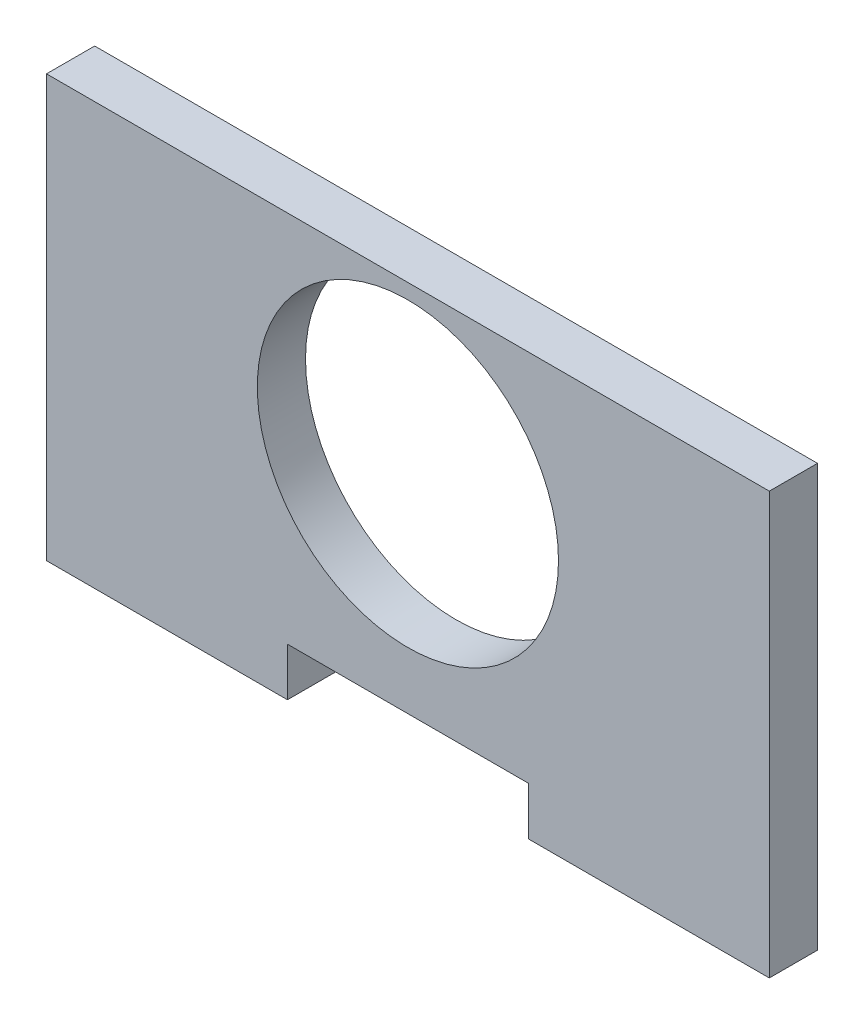
ISO-10303-21;
HEADER;
FILE_DESCRIPTION(('STEP AP214'),'2;1');
FILE_NAME('part.step','',(''),(''),'','','');
FILE_SCHEMA(('AUTOMOTIVE_DESIGN { 1 0 10303 214 1 1 1 1 }'));
ENDSEC;
DATA;
#1=APPLICATION_CONTEXT('core data for automotive mechanical design processes');
#2=APPLICATION_PROTOCOL_DEFINITION('international standard','automotive_design',2000,#1);
#3=PRODUCT_CONTEXT('',#1,'mechanical');
#4=PRODUCT('Part','Part','',(#3));
#5=PRODUCT_RELATED_PRODUCT_CATEGORY('part','',(#4));
#6=PRODUCT_DEFINITION_FORMATION('','',#4);
#7=PRODUCT_DEFINITION_CONTEXT('part definition',#1,'design');
#8=PRODUCT_DEFINITION('design','',#6,#7);
#9=PRODUCT_DEFINITION_SHAPE('','',#8);
#10=(LENGTH_UNIT() NAMED_UNIT(*) SI_UNIT(.MILLI.,.METRE.));
#11=(NAMED_UNIT(*) PLANE_ANGLE_UNIT() SI_UNIT($,.RADIAN.));
#12=(NAMED_UNIT(*) SI_UNIT($,.STERADIAN.) SOLID_ANGLE_UNIT());
#13=UNCERTAINTY_MEASURE_WITH_UNIT(LENGTH_MEASURE(1.E-05),#10,'distance_accuracy_value','');
#14=(GEOMETRIC_REPRESENTATION_CONTEXT(3) GLOBAL_UNCERTAINTY_ASSIGNED_CONTEXT((#13)) GLOBAL_UNIT_ASSIGNED_CONTEXT((#10,
#11,#12)) REPRESENTATION_CONTEXT('',''));
#15=CARTESIAN_POINT('',(0.,0.,0.));
#16=DIRECTION('',(0.,0.,1.));
#17=DIRECTION('',(1.,0.,0.));
#18=AXIS2_PLACEMENT_3D('',#15,#16,#17);
#19=CARTESIAN_POINT('',(-38.1,-22.225,5.08));
#20=DIRECTION('',(0.,1.,0.));
#21=DIRECTION('',(0.,0.,1.));
#22=AXIS2_PLACEMENT_3D('',#19,#20,#21);
#23=PLANE('',#22);
#24=DIRECTION('',(1.,0.,0.));
#25=VECTOR('',#24,1.);
#26=CARTESIAN_POINT('',(-38.1,-22.225,0.));
#27=LINE('',#26,#25);
#28=CARTESIAN_POINT('',(-38.1,-22.225,0.));
#29=VERTEX_POINT('',#28);
#30=CARTESIAN_POINT('',(-12.7,-22.225,0.));
#31=VERTEX_POINT('',#30);
#32=EDGE_CURVE('E138',#29,#31,#27,.T.);
#33=ORIENTED_EDGE('',*,*,#32,.T.);
#34=DIRECTION('',(0.,0.,-1.));
#35=VECTOR('',#34,1.);
#36=CARTESIAN_POINT('',(-12.7,-22.225,0.));
#37=LINE('',#36,#35);
#38=CARTESIAN_POINT('',(-12.7,-22.225,5.08));
#39=VERTEX_POINT('',#38);
#40=EDGE_CURVE('E169',#39,#31,#37,.T.);
#41=ORIENTED_EDGE('',*,*,#40,.F.);
#42=DIRECTION('',(1.,0.,0.));
#43=VECTOR('',#42,1.);
#44=CARTESIAN_POINT('',(-38.1,-22.225,5.08));
#45=LINE('',#44,#43);
#46=CARTESIAN_POINT('',(-38.1,-22.225,5.08));
#47=VERTEX_POINT('',#46);
#48=EDGE_CURVE('E142',#47,#39,#45,.T.);
#49=ORIENTED_EDGE('',*,*,#48,.F.);
#50=DIRECTION('',(0.,0.,-1.));
#51=VECTOR('',#50,1.);
#52=CARTESIAN_POINT('',(-38.1,-22.225,5.08));
#53=LINE('',#52,#51);
#54=EDGE_CURVE('E156',#47,#29,#53,.T.);
#55=ORIENTED_EDGE('',*,*,#54,.T.);
#56=EDGE_LOOP('',(#33,#41,#49,#55));
#57=FACE_BOUND('',#56,.T.);
#58=ADVANCED_FACE('F33',(#57),#23,.F.);
#59=CARTESIAN_POINT('',(38.1,-22.225,5.08));
#60=DIRECTION('',(-1.,0.,0.));
#61=DIRECTION('',(0.,0.,1.));
#62=AXIS2_PLACEMENT_3D('',#59,#60,#61);
#63=PLANE('',#62);
#64=DIRECTION('',(0.,1.,0.));
#65=VECTOR('',#64,1.);
#66=CARTESIAN_POINT('',(38.1,-22.225,0.));
#67=LINE('',#66,#65);
#68=CARTESIAN_POINT('',(38.1,-22.225,0.));
#69=VERTEX_POINT('',#68);
#70=CARTESIAN_POINT('',(38.1,22.225,0.));
#71=VERTEX_POINT('',#70);
#72=EDGE_CURVE('E146',#69,#71,#67,.T.);
#73=ORIENTED_EDGE('',*,*,#72,.T.);
#74=DIRECTION('',(0.,0.,-1.));
#75=VECTOR('',#74,1.);
#76=CARTESIAN_POINT('',(38.1,22.225,5.08));
#77=LINE('',#76,#75);
#78=CARTESIAN_POINT('',(38.1,22.225,5.08));
#79=VERTEX_POINT('',#78);
#80=EDGE_CURVE('E11',#79,#71,#77,.T.);
#81=ORIENTED_EDGE('',*,*,#80,.F.);
#82=DIRECTION('',(0.,1.,0.));
#83=VECTOR('',#82,1.);
#84=CARTESIAN_POINT('',(38.1,-22.225,5.08));
#85=LINE('',#84,#83);
#86=CARTESIAN_POINT('',(38.1,-22.225,5.08));
#87=VERTEX_POINT('',#86);
#88=EDGE_CURVE('E136',#87,#79,#85,.T.);
#89=ORIENTED_EDGE('',*,*,#88,.F.);
#90=DIRECTION('',(0.,0.,-1.));
#91=VECTOR('',#90,1.);
#92=CARTESIAN_POINT('',(38.1,-22.225,5.08));
#93=LINE('',#92,#91);
#94=EDGE_CURVE('E145',#87,#69,#93,.T.);
#95=ORIENTED_EDGE('',*,*,#94,.T.);
#96=EDGE_LOOP('',(#73,#81,#89,#95));
#97=FACE_BOUND('',#96,.T.);
#98=ADVANCED_FACE('F35',(#97),#63,.F.);
#99=CARTESIAN_POINT('',(-38.1,22.225,5.08));
#100=DIRECTION('',(0.,-1.,0.));
#101=DIRECTION('',(0.,0.,-1.));
#102=AXIS2_PLACEMENT_3D('',#99,#100,#101);
#103=PLANE('',#102);
#104=DIRECTION('',(-1.,0.,0.));
#105=VECTOR('',#104,1.);
#106=CARTESIAN_POINT('',(-38.1,22.225,0.));
#107=LINE('',#106,#105);
#108=CARTESIAN_POINT('',(-38.1,22.225,0.));
#109=VERTEX_POINT('',#108);
#110=EDGE_CURVE('E149',#71,#109,#107,.T.);
#111=ORIENTED_EDGE('',*,*,#110,.T.);
#112=DIRECTION('',(0.,0.,-1.));
#113=VECTOR('',#112,1.);
#114=CARTESIAN_POINT('',(-38.1,22.225,5.08));
#115=LINE('',#114,#113);
#116=CARTESIAN_POINT('',(-38.1,22.225,5.08));
#117=VERTEX_POINT('',#116);
#118=EDGE_CURVE('E42',#117,#109,#115,.T.);
#119=ORIENTED_EDGE('',*,*,#118,.F.);
#120=DIRECTION('',(-1.,0.,0.));
#121=VECTOR('',#120,1.);
#122=CARTESIAN_POINT('',(-38.1,22.225,5.08));
#123=LINE('',#122,#121);
#124=EDGE_CURVE('E87',#79,#117,#123,.T.);
#125=ORIENTED_EDGE('',*,*,#124,.F.);
#126=ORIENTED_EDGE('',*,*,#80,.T.);
#127=EDGE_LOOP('',(#111,#119,#125,#126));
#128=FACE_BOUND('',#127,.T.);
#129=ADVANCED_FACE('F176',(#128),#103,.F.);
#130=CARTESIAN_POINT('',(-38.1,-22.225,5.08));
#131=DIRECTION('',(1.,0.,0.));
#132=DIRECTION('',(0.,0.,-1.));
#133=AXIS2_PLACEMENT_3D('',#130,#131,#132);
#134=PLANE('',#133);
#135=DIRECTION('',(0.,-1.,0.));
#136=VECTOR('',#135,1.);
#137=CARTESIAN_POINT('',(-38.1,-22.225,0.));
#138=LINE('',#137,#136);
#139=EDGE_CURVE('E151',#109,#29,#138,.T.);
#140=ORIENTED_EDGE('',*,*,#139,.T.);
#141=ORIENTED_EDGE('',*,*,#54,.F.);
#142=DIRECTION('',(0.,-1.,0.));
#143=VECTOR('',#142,1.);
#144=CARTESIAN_POINT('',(-38.1,-22.225,5.08));
#145=LINE('',#144,#143);
#146=EDGE_CURVE('E140',#117,#47,#145,.T.);
#147=ORIENTED_EDGE('',*,*,#146,.F.);
#148=ORIENTED_EDGE('',*,*,#118,.T.);
#149=EDGE_LOOP('',(#140,#141,#147,#148));
#150=FACE_BOUND('',#149,.T.);
#151=ADVANCED_FACE('F163',(#150),#134,.F.);
#152=CARTESIAN_POINT('',(12.7,-22.225,5.08));
#153=VERTEX_POINT('',#152);
#154=EDGE_CURVE('E58',#153,#87,#45,.T.);
#155=ORIENTED_EDGE('',*,*,#154,.F.);
#156=DIRECTION('',(0.,0.,1.));
#157=VECTOR('',#156,1.);
#158=CARTESIAN_POINT('',(12.7,-22.225,0.));
#159=LINE('',#158,#157);
#160=CARTESIAN_POINT('',(12.7,-22.225,0.));
#161=VERTEX_POINT('',#160);
#162=EDGE_CURVE('E194',#161,#153,#159,.T.);
#163=ORIENTED_EDGE('',*,*,#162,.F.);
#164=EDGE_CURVE('E80',#161,#69,#27,.T.);
#165=ORIENTED_EDGE('',*,*,#164,.T.);
#166=ORIENTED_EDGE('',*,*,#94,.F.);
#167=EDGE_LOOP('',(#155,#163,#165,#166));
#168=FACE_BOUND('',#167,.T.);
#169=ADVANCED_FACE('F182',(#168),#23,.F.);
#170=CARTESIAN_POINT('',(0.,0.,5.08));
#171=DIRECTION('',(0.,0.,-1.));
#172=DIRECTION('',(-1.,0.,0.));
#173=AXIS2_PLACEMENT_3D('',#170,#171,#172);
#174=PLANE('',#173);
#175=ORIENTED_EDGE('',*,*,#48,.T.);
#176=DIRECTION('',(0.,-1.,0.));
#177=VECTOR('',#176,1.);
#178=CARTESIAN_POINT('',(-12.7,-17.145,5.08));
#179=LINE('',#178,#177);
#180=CARTESIAN_POINT('',(-12.7,-17.145,5.08));
#181=VERTEX_POINT('',#180);
#182=EDGE_CURVE('E128',#181,#39,#179,.T.);
#183=ORIENTED_EDGE('',*,*,#182,.F.);
#184=DIRECTION('',(-1.,0.,0.));
#185=VECTOR('',#184,1.);
#186=CARTESIAN_POINT('',(-12.7,-17.145,5.08));
#187=LINE('',#186,#185);
#188=CARTESIAN_POINT('',(12.7,-17.145,5.08));
#189=VERTEX_POINT('',#188);
#190=EDGE_CURVE('E115',#189,#181,#187,.T.);
#191=ORIENTED_EDGE('',*,*,#190,.F.);
#192=DIRECTION('',(0.,-1.,0.));
#193=VECTOR('',#192,1.);
#194=CARTESIAN_POINT('',(12.7,-17.145,5.08));
#195=LINE('',#194,#193);
#196=EDGE_CURVE('E113',#189,#153,#195,.T.);
#197=ORIENTED_EDGE('',*,*,#196,.T.);
#198=ORIENTED_EDGE('',*,*,#154,.T.);
#199=ORIENTED_EDGE('',*,*,#88,.T.);
#200=ORIENTED_EDGE('',*,*,#124,.T.);
#201=ORIENTED_EDGE('',*,*,#146,.T.);
#202=EDGE_LOOP('',(#175,#183,#191,#197,#198,#199,#200,#201));
#203=FACE_BOUND('',#202,.T.);
#204=CARTESIAN_POINT('',(0.,4.7625,5.08));
#205=DIRECTION('',(0.,0.,1.));
#206=DIRECTION('',(1.,0.,0.));
#207=AXIS2_PLACEMENT_3D('',#204,#205,#206);
#208=CIRCLE('',#207,15.875);
#209=CARTESIAN_POINT('',(15.875,4.7625,5.08));
#210=VERTEX_POINT('',#209);
#211=EDGE_CURVE('E133',#210,#210,#208,.T.);
#212=ORIENTED_EDGE('',*,*,#211,.F.);
#213=EDGE_LOOP('',(#212));
#214=FACE_BOUND('',#213,.T.);
#215=ADVANCED_FACE('F171',(#203,#214),#174,.F.);
#216=CARTESIAN_POINT('',(0.,0.,0.));
#217=DIRECTION('',(0.,0.,-1.));
#218=DIRECTION('',(-1.,0.,0.));
#219=AXIS2_PLACEMENT_3D('',#216,#217,#218);
#220=PLANE('',#219);
#221=DIRECTION('',(0.,-1.,0.));
#222=VECTOR('',#221,1.);
#223=CARTESIAN_POINT('',(-12.7,-17.145,0.));
#224=LINE('',#223,#222);
#225=CARTESIAN_POINT('',(-12.7,-17.145,0.));
#226=VERTEX_POINT('',#225);
#227=EDGE_CURVE('E126',#226,#31,#224,.T.);
#228=ORIENTED_EDGE('',*,*,#227,.T.);
#229=ORIENTED_EDGE('',*,*,#32,.F.);
#230=ORIENTED_EDGE('',*,*,#139,.F.);
#231=ORIENTED_EDGE('',*,*,#110,.F.);
#232=ORIENTED_EDGE('',*,*,#72,.F.);
#233=ORIENTED_EDGE('',*,*,#164,.F.);
#234=DIRECTION('',(0.,-1.,0.));
#235=VECTOR('',#234,1.);
#236=CARTESIAN_POINT('',(12.7,-17.145,0.));
#237=LINE('',#236,#235);
#238=CARTESIAN_POINT('',(12.7,-17.145,0.));
#239=VERTEX_POINT('',#238);
#240=EDGE_CURVE('E112',#239,#161,#237,.T.);
#241=ORIENTED_EDGE('',*,*,#240,.F.);
#242=DIRECTION('',(1.,0.,0.));
#243=VECTOR('',#242,1.);
#244=CARTESIAN_POINT('',(-12.7,-17.145,0.));
#245=LINE('',#244,#243);
#246=EDGE_CURVE('E116',#226,#239,#245,.T.);
#247=ORIENTED_EDGE('',*,*,#246,.F.);
#248=EDGE_LOOP('',(#228,#229,#230,#231,#232,#233,#241,#247));
#249=FACE_BOUND('',#248,.T.);
#250=CARTESIAN_POINT('',(0.,4.7625,0.));
#251=DIRECTION('',(0.,0.,-1.));
#252=DIRECTION('',(-1.,0.,0.));
#253=AXIS2_PLACEMENT_3D('',#250,#251,#252);
#254=CIRCLE('',#253,15.875);
#255=CARTESIAN_POINT('',(-15.875,4.7625,0.));
#256=VERTEX_POINT('',#255);
#257=EDGE_CURVE('E37',#256,#256,#254,.T.);
#258=ORIENTED_EDGE('',*,*,#257,.F.);
#259=EDGE_LOOP('',(#258));
#260=FACE_BOUND('',#259,.T.);
#261=ADVANCED_FACE('F123',(#249,#260),#220,.T.);
#262=CARTESIAN_POINT('',(0.,4.7625,-7.62));
#263=DIRECTION('',(0.,0.,1.));
#264=DIRECTION('',(1.,0.,0.));
#265=AXIS2_PLACEMENT_3D('',#262,#263,#264);
#266=CYLINDRICAL_SURFACE('',#265,15.875);
#267=ORIENTED_EDGE('',*,*,#257,.T.);
#268=EDGE_LOOP('',(#267));
#269=FACE_BOUND('',#268,.T.);
#270=ORIENTED_EDGE('',*,*,#211,.T.);
#271=EDGE_LOOP('',(#270));
#272=FACE_BOUND('',#271,.T.);
#273=ADVANCED_FACE('F202',(#269,#272),#266,.F.);
#274=CARTESIAN_POINT('',(-12.7,-17.145,0.));
#275=DIRECTION('',(-1.,0.,0.));
#276=DIRECTION('',(0.,0.,1.));
#277=AXIS2_PLACEMENT_3D('',#274,#275,#276);
#278=PLANE('',#277);
#279=ORIENTED_EDGE('',*,*,#40,.T.);
#280=ORIENTED_EDGE('',*,*,#227,.F.);
#281=DIRECTION('',(0.,0.,-1.));
#282=VECTOR('',#281,1.);
#283=CARTESIAN_POINT('',(-12.7,-17.145,0.));
#284=LINE('',#283,#282);
#285=EDGE_CURVE('E49',#181,#226,#284,.T.);
#286=ORIENTED_EDGE('',*,*,#285,.F.);
#287=ORIENTED_EDGE('',*,*,#182,.T.);
#288=EDGE_LOOP('',(#279,#280,#286,#287));
#289=FACE_BOUND('',#288,.T.);
#290=ADVANCED_FACE('F200',(#289),#278,.F.);
#291=CARTESIAN_POINT('',(12.7,-17.145,0.));
#292=DIRECTION('',(1.,0.,0.));
#293=DIRECTION('',(0.,0.,-1.));
#294=AXIS2_PLACEMENT_3D('',#291,#292,#293);
#295=PLANE('',#294);
#296=ORIENTED_EDGE('',*,*,#162,.T.);
#297=ORIENTED_EDGE('',*,*,#196,.F.);
#298=DIRECTION('',(0.,0.,1.));
#299=VECTOR('',#298,1.);
#300=CARTESIAN_POINT('',(12.7,-17.145,0.));
#301=LINE('',#300,#299);
#302=EDGE_CURVE('E109',#239,#189,#301,.T.);
#303=ORIENTED_EDGE('',*,*,#302,.F.);
#304=ORIENTED_EDGE('',*,*,#240,.T.);
#305=EDGE_LOOP('',(#296,#297,#303,#304));
#306=FACE_BOUND('',#305,.T.);
#307=ADVANCED_FACE('F110',(#306),#295,.F.);
#308=CARTESIAN_POINT('',(0.,-17.145,0.));
#309=DIRECTION('',(0.,1.,0.));
#310=DIRECTION('',(0.,0.,1.));
#311=AXIS2_PLACEMENT_3D('',#308,#309,#310);
#312=PLANE('',#311);
#313=ORIENTED_EDGE('',*,*,#285,.T.);
#314=ORIENTED_EDGE('',*,*,#246,.T.);
#315=ORIENTED_EDGE('',*,*,#302,.T.);
#316=ORIENTED_EDGE('',*,*,#190,.T.);
#317=EDGE_LOOP('',(#313,#314,#315,#316));
#318=FACE_BOUND('',#317,.T.);
#319=ADVANCED_FACE('F119',(#318),#312,.F.);
#320=CLOSED_SHELL('',(#58,#98,#129,#151,#169,#215,#261,#273,#290,#307,#319));
#321=MANIFOLD_SOLID_BREP('B2',#320);
#322=ADVANCED_BREP_SHAPE_REPRESENTATION('',(#18,#321),#14);
#323=SHAPE_DEFINITION_REPRESENTATION(#9,#322);
ENDSEC;
END-ISO-10303-21;
